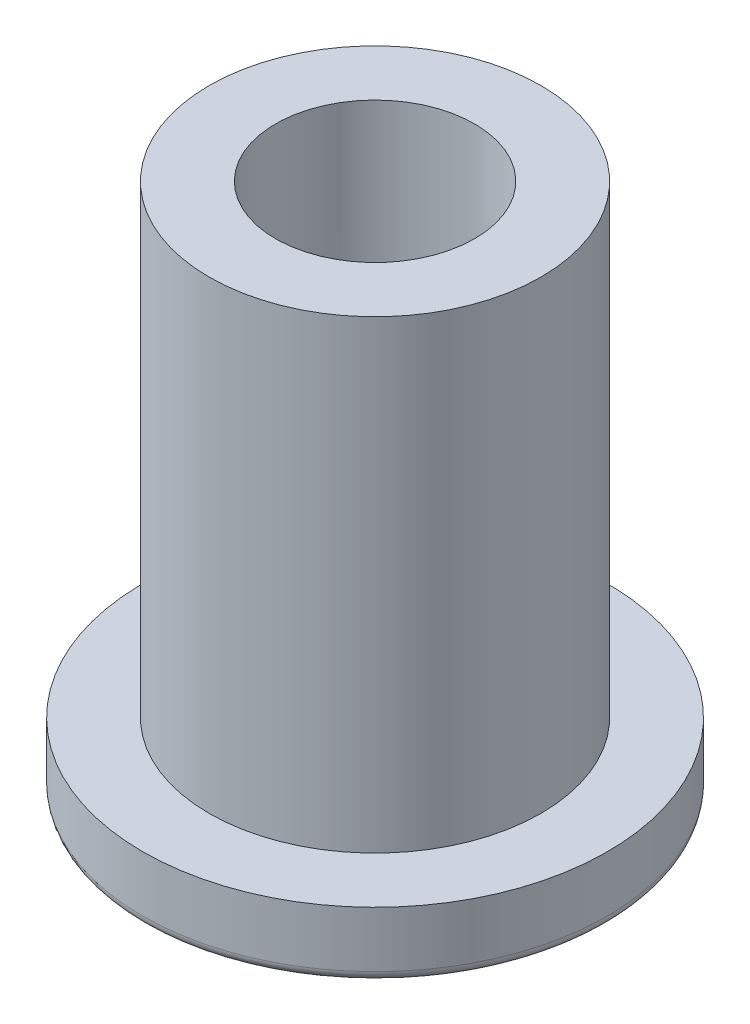
ISO-10303-21;
HEADER;
FILE_DESCRIPTION(('STEP AP214'),'2;1');
FILE_NAME('part.step','',(''),(''),'','','');
FILE_SCHEMA(('AUTOMOTIVE_DESIGN { 1 0 10303 214 1 1 1 1 }'));
ENDSEC;
DATA;
#1=APPLICATION_CONTEXT('core data for automotive mechanical design processes');
#2=APPLICATION_PROTOCOL_DEFINITION('international standard','automotive_design',2000,#1);
#3=PRODUCT_CONTEXT('',#1,'mechanical');
#4=PRODUCT('Part','Part','',(#3));
#5=PRODUCT_RELATED_PRODUCT_CATEGORY('part','',(#4));
#6=PRODUCT_DEFINITION_FORMATION('','',#4);
#7=PRODUCT_DEFINITION_CONTEXT('part definition',#1,'design');
#8=PRODUCT_DEFINITION('design','',#6,#7);
#9=PRODUCT_DEFINITION_SHAPE('','',#8);
#10=(LENGTH_UNIT() NAMED_UNIT(*) SI_UNIT(.MILLI.,.METRE.));
#11=(NAMED_UNIT(*) PLANE_ANGLE_UNIT() SI_UNIT($,.RADIAN.));
#12=(NAMED_UNIT(*) SI_UNIT($,.STERADIAN.) SOLID_ANGLE_UNIT());
#13=UNCERTAINTY_MEASURE_WITH_UNIT(LENGTH_MEASURE(1.E-05),#10,'distance_accuracy_value','');
#14=(GEOMETRIC_REPRESENTATION_CONTEXT(3) GLOBAL_UNCERTAINTY_ASSIGNED_CONTEXT((#13)) GLOBAL_UNIT_ASSIGNED_CONTEXT((#10,
#11,#12)) REPRESENTATION_CONTEXT('',''));
#15=CARTESIAN_POINT('',(0.,0.,0.));
#16=DIRECTION('',(0.,0.,1.));
#17=DIRECTION('',(1.,0.,0.));
#18=AXIS2_PLACEMENT_3D('',#15,#16,#17);
#19=CARTESIAN_POINT('',(0.,1.5875,0.));
#20=DIRECTION('',(0.,-1.,0.));
#21=DIRECTION('',(0.,0.,-1.));
#22=AXIS2_PLACEMENT_3D('',#19,#20,#21);
#23=CYLINDRICAL_SURFACE('',#22,5.55625);
#24=CARTESIAN_POINT('',(0.,0.254,0.));
#25=DIRECTION('',(0.,1.,0.));
#26=DIRECTION('',(0.,0.,1.));
#27=AXIS2_PLACEMENT_3D('',#24,#25,#26);
#28=CIRCLE('',#27,5.55625);
#29=CARTESIAN_POINT('',(0.,0.254,5.55625));
#30=VERTEX_POINT('',#29);
#31=EDGE_CURVE('E52',#30,#30,#28,.T.);
#32=ORIENTED_EDGE('',*,*,#31,.T.);
#33=EDGE_LOOP('',(#32));
#34=FACE_BOUND('',#33,.T.);
#35=CARTESIAN_POINT('',(0.,1.5875,0.));
#36=DIRECTION('',(0.,1.,0.));
#37=DIRECTION('',(0.,0.,1.));
#38=AXIS2_PLACEMENT_3D('',#35,#36,#37);
#39=CIRCLE('',#38,5.55625);
#40=CARTESIAN_POINT('',(0.,1.5875,5.55625));
#41=VERTEX_POINT('',#40);
#42=EDGE_CURVE('E62',#41,#41,#39,.T.);
#43=ORIENTED_EDGE('',*,*,#42,.F.);
#44=EDGE_LOOP('',(#43));
#45=FACE_BOUND('',#44,.T.);
#46=ADVANCED_FACE('F44',(#34,#45),#23,.T.);
#47=CARTESIAN_POINT('',(0.,1.5875,0.));
#48=DIRECTION('',(0.,1.,0.));
#49=DIRECTION('',(0.,0.,1.));
#50=AXIS2_PLACEMENT_3D('',#47,#48,#49);
#51=PLANE('',#50);
#52=CARTESIAN_POINT('',(0.,1.5875,0.));
#53=DIRECTION('',(0.,1.,0.));
#54=DIRECTION('',(0.,0.,1.));
#55=AXIS2_PLACEMENT_3D('',#52,#53,#54);
#56=CIRCLE('',#55,3.96875);
#57=CARTESIAN_POINT('',(0.,1.5875,3.96875));
#58=VERTEX_POINT('',#57);
#59=EDGE_CURVE('E69',#58,#58,#56,.T.);
#60=ORIENTED_EDGE('',*,*,#59,.F.);
#61=EDGE_LOOP('',(#60));
#62=FACE_BOUND('',#61,.T.);
#63=ORIENTED_EDGE('',*,*,#42,.T.);
#64=EDGE_LOOP('',(#63));
#65=FACE_BOUND('',#64,.T.);
#66=ADVANCED_FACE('F96',(#62,#65),#51,.T.);
#67=CARTESIAN_POINT('',(0.,0.,0.));
#68=DIRECTION('',(0.,1.,0.));
#69=DIRECTION('',(0.,0.,1.));
#70=AXIS2_PLACEMENT_3D('',#67,#68,#69);
#71=PLANE('',#70);
#72=CARTESIAN_POINT('',(0.,0.,0.));
#73=DIRECTION('',(0.,1.,0.));
#74=DIRECTION('',(0.,0.,1.));
#75=AXIS2_PLACEMENT_3D('',#72,#73,#74);
#76=CIRCLE('',#75,5.30225);
#77=CARTESIAN_POINT('',(0.,0.,5.30225));
#78=VERTEX_POINT('',#77);
#79=EDGE_CURVE('E11',#78,#78,#76,.F.);
#80=ORIENTED_EDGE('',*,*,#79,.T.);
#81=EDGE_LOOP('',(#80));
#82=FACE_BOUND('',#81,.T.);
#83=ADVANCED_FACE('F87',(#82),#71,.F.);
#84=CARTESIAN_POINT('',(0.,12.7,0.));
#85=DIRECTION('',(0.,1.,0.));
#86=DIRECTION('',(0.,0.,1.));
#87=AXIS2_PLACEMENT_3D('',#84,#85,#86);
#88=PLANE('',#87);
#89=CARTESIAN_POINT('',(0.,12.7,0.));
#90=DIRECTION('',(0.,1.,0.));
#91=DIRECTION('',(0.,0.,1.));
#92=AXIS2_PLACEMENT_3D('',#89,#90,#91);
#93=CIRCLE('',#92,3.96875);
#94=CARTESIAN_POINT('',(0.,12.7,3.96875));
#95=VERTEX_POINT('',#94);
#96=EDGE_CURVE('E68',#95,#95,#93,.T.);
#97=ORIENTED_EDGE('',*,*,#96,.T.);
#98=EDGE_LOOP('',(#97));
#99=FACE_BOUND('',#98,.T.);
#100=CARTESIAN_POINT('',(0.,12.7,0.));
#101=DIRECTION('',(0.,1.,0.));
#102=DIRECTION('',(1.,0.,0.));
#103=AXIS2_PLACEMENT_3D('',#100,#101,#102);
#104=CIRCLE('',#103,2.38125);
#105=CARTESIAN_POINT('',(2.38125,12.7,0.));
#106=VERTEX_POINT('',#105);
#107=EDGE_CURVE('E73',#106,#106,#104,.T.);
#108=ORIENTED_EDGE('',*,*,#107,.F.);
#109=EDGE_LOOP('',(#108));
#110=FACE_BOUND('',#109,.T.);
#111=ADVANCED_FACE('F84',(#99,#110),#88,.T.);
#112=CARTESIAN_POINT('',(0.,12.7,0.));
#113=DIRECTION('',(0.,-1.,0.));
#114=DIRECTION('',(0.,0.,-1.));
#115=AXIS2_PLACEMENT_3D('',#112,#113,#114);
#116=CYLINDRICAL_SURFACE('',#115,3.96875);
#117=ORIENTED_EDGE('',*,*,#96,.F.);
#118=EDGE_LOOP('',(#117));
#119=FACE_BOUND('',#118,.T.);
#120=ORIENTED_EDGE('',*,*,#59,.T.);
#121=EDGE_LOOP('',(#120));
#122=FACE_BOUND('',#121,.T.);
#123=ADVANCED_FACE('F86',(#119,#122),#116,.T.);
#124=CARTESIAN_POINT('',(0.,12.7,0.));
#125=DIRECTION('',(0.,-1.,0.));
#126=DIRECTION('',(0.,0.,-1.));
#127=AXIS2_PLACEMENT_3D('',#124,#125,#126);
#128=CYLINDRICAL_SURFACE('',#127,2.38125);
#129=ORIENTED_EDGE('',*,*,#107,.T.);
#130=EDGE_LOOP('',(#129));
#131=FACE_BOUND('',#130,.T.);
#132=CARTESIAN_POINT('',(0.,1.5875,0.));
#133=DIRECTION('',(0.,1.,0.));
#134=DIRECTION('',(0.,0.,1.));
#135=AXIS2_PLACEMENT_3D('',#132,#133,#134);
#136=CIRCLE('',#135,2.38125);
#137=CARTESIAN_POINT('',(0.,1.5875,2.38125));
#138=VERTEX_POINT('',#137);
#139=EDGE_CURVE('E57',#138,#138,#136,.F.);
#140=ORIENTED_EDGE('',*,*,#139,.T.);
#141=EDGE_LOOP('',(#140));
#142=FACE_BOUND('',#141,.T.);
#143=ADVANCED_FACE('F81',(#131,#142),#128,.F.);
#144=ORIENTED_EDGE('',*,*,#139,.F.);
#145=EDGE_LOOP('',(#144));
#146=FACE_BOUND('',#145,.T.);
#147=ADVANCED_FACE('F105',(#146),#51,.T.);
#148=CARTESIAN_POINT('',(0.,0.254,0.));
#149=DIRECTION('',(0.,1.,0.));
#150=DIRECTION('',(0.,0.,1.));
#151=AXIS2_PLACEMENT_3D('',#148,#149,#150);
#152=TOROIDAL_SURFACE('',#151,5.30225,0.254);
#153=ORIENTED_EDGE('',*,*,#79,.F.);
#154=EDGE_LOOP('',(#153));
#155=FACE_BOUND('',#154,.T.);
#156=ORIENTED_EDGE('',*,*,#31,.F.);
#157=EDGE_LOOP('',(#156));
#158=FACE_BOUND('',#157,.T.);
#159=ADVANCED_FACE('F46',(#155,#158),#152,.T.);
#160=CLOSED_SHELL('',(#46,#66,#83,#111,#123,#143,#147,#159));
#161=MANIFOLD_SOLID_BREP('B2',#160);
#162=ADVANCED_BREP_SHAPE_REPRESENTATION('',(#18,#161),#14);
#163=SHAPE_DEFINITION_REPRESENTATION(#9,#162);
ENDSEC;
END-ISO-10303-21;
